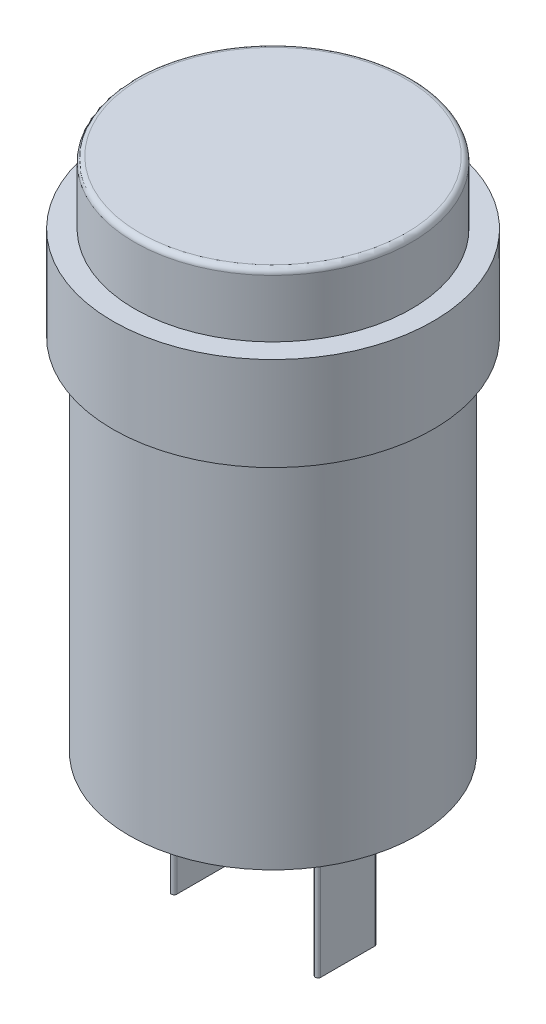
ISO-10303-21;
HEADER;
FILE_DESCRIPTION(('STEP AP214'),'2;1');
FILE_NAME('part.step','',(''),(''),'','','');
FILE_SCHEMA(('AUTOMOTIVE_DESIGN { 1 0 10303 214 1 1 1 1 }'));
ENDSEC;
DATA;
#1=APPLICATION_CONTEXT('core data for automotive mechanical design processes');
#2=APPLICATION_PROTOCOL_DEFINITION('international standard','automotive_design',2000,#1);
#3=PRODUCT_CONTEXT('',#1,'mechanical');
#4=PRODUCT('Part','Part','',(#3));
#5=PRODUCT_RELATED_PRODUCT_CATEGORY('part','',(#4));
#6=PRODUCT_DEFINITION_FORMATION('','',#4);
#7=PRODUCT_DEFINITION_CONTEXT('part definition',#1,'design');
#8=PRODUCT_DEFINITION('design','',#6,#7);
#9=PRODUCT_DEFINITION_SHAPE('','',#8);
#10=(LENGTH_UNIT() NAMED_UNIT(*) SI_UNIT(.MILLI.,.METRE.));
#11=(NAMED_UNIT(*) PLANE_ANGLE_UNIT() SI_UNIT($,.RADIAN.));
#12=(NAMED_UNIT(*) SI_UNIT($,.STERADIAN.) SOLID_ANGLE_UNIT());
#13=UNCERTAINTY_MEASURE_WITH_UNIT(LENGTH_MEASURE(1.E-05),#10,'distance_accuracy_value','');
#14=(GEOMETRIC_REPRESENTATION_CONTEXT(3) GLOBAL_UNCERTAINTY_ASSIGNED_CONTEXT((#13)) GLOBAL_UNIT_ASSIGNED_CONTEXT((#10,
#11,#12)) REPRESENTATION_CONTEXT('',''));
#15=CARTESIAN_POINT('',(0.,0.,0.));
#16=DIRECTION('',(0.,0.,1.));
#17=DIRECTION('',(1.,0.,0.));
#18=AXIS2_PLACEMENT_3D('',#15,#16,#17);
#19=CARTESIAN_POINT('',(0.,9.19984369533566,0.));
#20=DIRECTION('',(0.,1.,0.));
#21=DIRECTION('',(0.,0.,1.));
#22=AXIS2_PLACEMENT_3D('',#19,#20,#21);
#23=PLANE('',#22);
#24=CARTESIAN_POINT('',(0.,9.19984369533566,0.));
#25=DIRECTION('',(0.,1.,0.));
#26=DIRECTION('',(0.,0.,1.));
#27=AXIS2_PLACEMENT_3D('',#24,#25,#26);
#28=CIRCLE('',#27,12.2375);
#29=CARTESIAN_POINT('',(0.,9.19984369533566,12.2375));
#30=VERTEX_POINT('',#29);
#31=EDGE_CURVE('E195',#30,#30,#28,.T.);
#32=ORIENTED_EDGE('',*,*,#31,.T.);
#33=EDGE_LOOP('',(#32));
#34=FACE_BOUND('',#33,.T.);
#35=CARTESIAN_POINT('',(0.,9.19984369533566,0.));
#36=DIRECTION('',(0.,1.,0.));
#37=DIRECTION('',(0.,0.,1.));
#38=AXIS2_PLACEMENT_3D('',#35,#36,#37);
#39=CIRCLE('',#38,10.5875);
#40=CARTESIAN_POINT('',(0.,9.19984369533566,10.5875));
#41=VERTEX_POINT('',#40);
#42=EDGE_CURVE('E267',#41,#41,#39,.T.);
#43=ORIENTED_EDGE('',*,*,#42,.F.);
#44=EDGE_LOOP('',(#43));
#45=FACE_BOUND('',#44,.T.);
#46=ADVANCED_FACE('F51',(#34,#45),#23,.T.);
#47=CARTESIAN_POINT('',(0.,-25.4501563046643,0.));
#48=DIRECTION('',(0.,-1.,0.));
#49=DIRECTION('',(0.,0.,-1.));
#50=AXIS2_PLACEMENT_3D('',#47,#48,#49);
#51=PLANE('',#50);
#52=DIRECTION('',(0.,0.,-1.));
#53=VECTOR('',#52,1.);
#54=CARTESIAN_POINT('',(5.29375,-25.4501563046643,2.0625));
#55=LINE('',#54,#53);
#56=CARTESIAN_POINT('',(5.29375,-25.4501563046643,2.0625));
#57=VERTEX_POINT('',#56);
#58=CARTESIAN_POINT('',(5.29375,-25.4501563046643,-2.0625));
#59=VERTEX_POINT('',#58);
#60=EDGE_CURVE('E151',#57,#59,#55,.T.);
#61=ORIENTED_EDGE('',*,*,#60,.F.);
#62=CARTESIAN_POINT('',(5.5,-25.4501563046643,2.0625));
#63=DIRECTION('',(0.,-1.,0.));
#64=DIRECTION('',(0.,0.,-1.));
#65=AXIS2_PLACEMENT_3D('',#62,#63,#64);
#66=CIRCLE('',#65,0.206249999999999);
#67=CARTESIAN_POINT('',(5.70625,-25.4501563046643,2.0625));
#68=VERTEX_POINT('',#67);
#69=EDGE_CURVE('E146',#68,#57,#66,.T.);
#70=ORIENTED_EDGE('',*,*,#69,.F.);
#71=DIRECTION('',(0.,0.,1.));
#72=VECTOR('',#71,1.);
#73=CARTESIAN_POINT('',(5.70625,-25.4501563046643,2.0625));
#74=LINE('',#73,#72);
#75=CARTESIAN_POINT('',(5.70625,-25.4501563046643,-2.0625));
#76=VERTEX_POINT('',#75);
#77=EDGE_CURVE('E161',#76,#68,#74,.T.);
#78=ORIENTED_EDGE('',*,*,#77,.F.);
#79=CARTESIAN_POINT('',(5.5,-25.4501563046643,-2.0625));
#80=DIRECTION('',(0.,-1.,0.));
#81=DIRECTION('',(0.,0.,-1.));
#82=AXIS2_PLACEMENT_3D('',#79,#80,#81);
#83=CIRCLE('',#82,0.206249999999999);
#84=EDGE_CURVE('E173',#59,#76,#83,.T.);
#85=ORIENTED_EDGE('',*,*,#84,.F.);
#86=EDGE_LOOP('',(#61,#70,#78,#85));
#87=FACE_BOUND('',#86,.T.);
#88=CARTESIAN_POINT('',(0.,-25.4501563046643,0.));
#89=DIRECTION('',(0.,-1.,0.));
#90=DIRECTION('',(0.,0.,-1.));
#91=AXIS2_PLACEMENT_3D('',#88,#89,#90);
#92=CIRCLE('',#91,11.);
#93=CARTESIAN_POINT('',(0.,-25.4501563046643,-11.));
#94=VERTEX_POINT('',#93);
#95=EDGE_CURVE('E190',#94,#94,#92,.T.);
#96=ORIENTED_EDGE('',*,*,#95,.T.);
#97=EDGE_LOOP('',(#96));
#98=FACE_BOUND('',#97,.T.);
#99=DIRECTION('',(0.,0.,-1.));
#100=VECTOR('',#99,1.);
#101=CARTESIAN_POINT('',(-5.70625,-25.4501563046643,2.0625));
#102=LINE('',#101,#100);
#103=CARTESIAN_POINT('',(-5.70625,-25.4501563046643,2.0625));
#104=VERTEX_POINT('',#103);
#105=CARTESIAN_POINT('',(-5.70625,-25.4501563046643,-2.0625));
#106=VERTEX_POINT('',#105);
#107=EDGE_CURVE('E259',#104,#106,#102,.T.);
#108=ORIENTED_EDGE('',*,*,#107,.F.);
#109=CARTESIAN_POINT('',(-5.5,-25.4501563046643,2.0625));
#110=DIRECTION('',(0.,-1.,0.));
#111=DIRECTION('',(0.,0.,-1.));
#112=AXIS2_PLACEMENT_3D('',#109,#110,#111);
#113=CIRCLE('',#112,0.206249999999999);
#114=CARTESIAN_POINT('',(-5.29375,-25.4501563046643,2.0625));
#115=VERTEX_POINT('',#114);
#116=EDGE_CURVE('E143',#115,#104,#113,.T.);
#117=ORIENTED_EDGE('',*,*,#116,.F.);
#118=DIRECTION('',(0.,0.,1.));
#119=VECTOR('',#118,1.);
#120=CARTESIAN_POINT('',(-5.29375,-25.4501563046643,2.0625));
#121=LINE('',#120,#119);
#122=CARTESIAN_POINT('',(-5.29375,-25.4501563046643,-2.0625));
#123=VERTEX_POINT('',#122);
#124=EDGE_CURVE('E139',#123,#115,#121,.T.);
#125=ORIENTED_EDGE('',*,*,#124,.F.);
#126=CARTESIAN_POINT('',(-5.5,-25.4501563046643,-2.0625));
#127=DIRECTION('',(0.,-1.,0.));
#128=DIRECTION('',(0.,0.,-1.));
#129=AXIS2_PLACEMENT_3D('',#126,#127,#128);
#130=CIRCLE('',#129,0.206249999999999);
#131=EDGE_CURVE('E261',#106,#123,#130,.T.);
#132=ORIENTED_EDGE('',*,*,#131,.F.);
#133=EDGE_LOOP('',(#108,#117,#125,#132));
#134=FACE_BOUND('',#133,.T.);
#135=ADVANCED_FACE('F220',(#87,#98,#134),#51,.T.);
#136=CARTESIAN_POINT('',(0.,2.04984369533566,0.));
#137=DIRECTION('',(0.,1.,0.));
#138=DIRECTION('',(0.,0.,1.));
#139=AXIS2_PLACEMENT_3D('',#136,#137,#138);
#140=PLANE('',#139);
#141=CARTESIAN_POINT('',(0.,2.04984369533566,0.));
#142=DIRECTION('',(0.,1.,0.));
#143=DIRECTION('',(0.,0.,1.));
#144=AXIS2_PLACEMENT_3D('',#141,#142,#143);
#145=CIRCLE('',#144,12.2375);
#146=CARTESIAN_POINT('',(0.,2.04984369533566,12.2375));
#147=VERTEX_POINT('',#146);
#148=EDGE_CURVE('E194',#147,#147,#145,.T.);
#149=ORIENTED_EDGE('',*,*,#148,.F.);
#150=EDGE_LOOP('',(#149));
#151=FACE_BOUND('',#150,.T.);
#152=CARTESIAN_POINT('',(0.,2.04984369533566,0.));
#153=DIRECTION('',(0.,1.,0.));
#154=DIRECTION('',(0.,0.,1.));
#155=AXIS2_PLACEMENT_3D('',#152,#153,#154);
#156=CIRCLE('',#155,11.);
#157=CARTESIAN_POINT('',(0.,2.04984369533566,11.));
#158=VERTEX_POINT('',#157);
#159=EDGE_CURVE('E199',#158,#158,#156,.F.);
#160=ORIENTED_EDGE('',*,*,#159,.F.);
#161=EDGE_LOOP('',(#160));
#162=FACE_BOUND('',#161,.T.);
#163=ADVANCED_FACE('F226',(#151,#162),#140,.F.);
#164=CARTESIAN_POINT('',(0.,9.19984369533566,0.));
#165=DIRECTION('',(0.,-1.,0.));
#166=DIRECTION('',(0.,0.,-1.));
#167=AXIS2_PLACEMENT_3D('',#164,#165,#166);
#168=CYLINDRICAL_SURFACE('',#167,12.2375);
#169=ORIENTED_EDGE('',*,*,#31,.F.);
#170=EDGE_LOOP('',(#169));
#171=FACE_BOUND('',#170,.T.);
#172=ORIENTED_EDGE('',*,*,#148,.T.);
#173=EDGE_LOOP('',(#172));
#174=FACE_BOUND('',#173,.T.);
#175=ADVANCED_FACE('F234',(#171,#174),#168,.T.);
#176=CARTESIAN_POINT('',(0.,-25.4501563046643,0.));
#177=DIRECTION('',(0.,1.,0.));
#178=DIRECTION('',(0.,0.,1.));
#179=AXIS2_PLACEMENT_3D('',#176,#177,#178);
#180=CYLINDRICAL_SURFACE('',#179,11.);
#181=ORIENTED_EDGE('',*,*,#95,.F.);
#182=EDGE_LOOP('',(#181));
#183=FACE_BOUND('',#182,.T.);
#184=ORIENTED_EDGE('',*,*,#159,.T.);
#185=EDGE_LOOP('',(#184));
#186=FACE_BOUND('',#185,.T.);
#187=ADVANCED_FACE('F232',(#183,#186),#180,.T.);
#188=CARTESIAN_POINT('',(5.5,-36.4501563046643,2.0625));
#189=DIRECTION('',(0.,1.,0.));
#190=DIRECTION('',(0.,0.,1.));
#191=AXIS2_PLACEMENT_3D('',#188,#189,#190);
#192=CYLINDRICAL_SURFACE('',#191,0.206249999999999);
#193=ORIENTED_EDGE('',*,*,#69,.T.);
#194=DIRECTION('',(0.,1.,0.));
#195=VECTOR('',#194,1.);
#196=CARTESIAN_POINT('',(5.29375,-36.4501563046643,2.0625));
#197=LINE('',#196,#195);
#198=CARTESIAN_POINT('',(5.29375,-36.4501563046643,2.0625));
#199=VERTEX_POINT('',#198);
#200=EDGE_CURVE('E187',#199,#57,#197,.T.);
#201=ORIENTED_EDGE('',*,*,#200,.F.);
#202=CARTESIAN_POINT('',(5.5,-36.4501563046643,2.0625));
#203=DIRECTION('',(0.,-1.,0.));
#204=DIRECTION('',(0.,0.,-1.));
#205=AXIS2_PLACEMENT_3D('',#202,#203,#204);
#206=CIRCLE('',#205,0.206249999999999);
#207=CARTESIAN_POINT('',(5.70625,-36.4501563046643,2.0625));
#208=VERTEX_POINT('',#207);
#209=EDGE_CURVE('E156',#208,#199,#206,.T.);
#210=ORIENTED_EDGE('',*,*,#209,.F.);
#211=DIRECTION('',(0.,1.,0.));
#212=VECTOR('',#211,1.);
#213=CARTESIAN_POINT('',(5.70625,-36.4501563046643,2.0625));
#214=LINE('',#213,#212);
#215=EDGE_CURVE('E169',#208,#68,#214,.T.);
#216=ORIENTED_EDGE('',*,*,#215,.T.);
#217=EDGE_LOOP('',(#193,#201,#210,#216));
#218=FACE_BOUND('',#217,.T.);
#219=ADVANCED_FACE('F241',(#218),#192,.T.);
#220=CARTESIAN_POINT('',(5.29375,-36.4501563046643,2.0625));
#221=DIRECTION('',(1.,0.,0.));
#222=DIRECTION('',(0.,0.,-1.));
#223=AXIS2_PLACEMENT_3D('',#220,#221,#222);
#224=PLANE('',#223);
#225=ORIENTED_EDGE('',*,*,#60,.T.);
#226=DIRECTION('',(0.,1.,0.));
#227=VECTOR('',#226,1.);
#228=CARTESIAN_POINT('',(5.29375,-36.4501563046643,-2.0625));
#229=LINE('',#228,#227);
#230=CARTESIAN_POINT('',(5.29375,-36.4501563046643,-2.0625));
#231=VERTEX_POINT('',#230);
#232=EDGE_CURVE('E183',#231,#59,#229,.T.);
#233=ORIENTED_EDGE('',*,*,#232,.F.);
#234=DIRECTION('',(0.,0.,-1.));
#235=VECTOR('',#234,1.);
#236=CARTESIAN_POINT('',(5.29375,-36.4501563046643,2.0625));
#237=LINE('',#236,#235);
#238=EDGE_CURVE('E160',#199,#231,#237,.T.);
#239=ORIENTED_EDGE('',*,*,#238,.F.);
#240=ORIENTED_EDGE('',*,*,#200,.T.);
#241=EDGE_LOOP('',(#225,#233,#239,#240));
#242=FACE_BOUND('',#241,.T.);
#243=ADVANCED_FACE('F252',(#242),#224,.F.);
#244=CARTESIAN_POINT('',(5.5,-36.4501563046643,-2.0625));
#245=DIRECTION('',(0.,1.,0.));
#246=DIRECTION('',(0.,0.,1.));
#247=AXIS2_PLACEMENT_3D('',#244,#245,#246);
#248=CYLINDRICAL_SURFACE('',#247,0.206249999999999);
#249=ORIENTED_EDGE('',*,*,#84,.T.);
#250=DIRECTION('',(0.,1.,0.));
#251=VECTOR('',#250,1.);
#252=CARTESIAN_POINT('',(5.70625,-36.4501563046643,-2.0625));
#253=LINE('',#252,#251);
#254=CARTESIAN_POINT('',(5.70625,-36.4501563046643,-2.0625));
#255=VERTEX_POINT('',#254);
#256=EDGE_CURVE('E75',#255,#76,#253,.T.);
#257=ORIENTED_EDGE('',*,*,#256,.F.);
#258=CARTESIAN_POINT('',(5.5,-36.4501563046643,-2.0625));
#259=DIRECTION('',(0.,-1.,0.));
#260=DIRECTION('',(0.,0.,-1.));
#261=AXIS2_PLACEMENT_3D('',#258,#259,#260);
#262=CIRCLE('',#261,0.206249999999999);
#263=EDGE_CURVE('E164',#231,#255,#262,.T.);
#264=ORIENTED_EDGE('',*,*,#263,.F.);
#265=ORIENTED_EDGE('',*,*,#232,.T.);
#266=EDGE_LOOP('',(#249,#257,#264,#265));
#267=FACE_BOUND('',#266,.T.);
#268=ADVANCED_FACE('F310',(#267),#248,.T.);
#269=CARTESIAN_POINT('',(5.70625,-36.4501563046643,2.0625));
#270=DIRECTION('',(-1.,0.,0.));
#271=DIRECTION('',(0.,0.,1.));
#272=AXIS2_PLACEMENT_3D('',#269,#270,#271);
#273=PLANE('',#272);
#274=ORIENTED_EDGE('',*,*,#77,.T.);
#275=ORIENTED_EDGE('',*,*,#215,.F.);
#276=DIRECTION('',(0.,0.,1.));
#277=VECTOR('',#276,1.);
#278=CARTESIAN_POINT('',(5.70625,-36.4501563046643,2.0625));
#279=LINE('',#278,#277);
#280=EDGE_CURVE('E167',#255,#208,#279,.T.);
#281=ORIENTED_EDGE('',*,*,#280,.F.);
#282=ORIENTED_EDGE('',*,*,#256,.T.);
#283=EDGE_LOOP('',(#274,#275,#281,#282));
#284=FACE_BOUND('',#283,.T.);
#285=ADVANCED_FACE('F306',(#284),#273,.F.);
#286=CARTESIAN_POINT('',(5.5,-36.4501563046643,2.0625));
#287=DIRECTION('',(0.,-1.,0.));
#288=DIRECTION('',(0.,0.,-1.));
#289=AXIS2_PLACEMENT_3D('',#286,#287,#288);
#290=PLANE('',#289);
#291=ORIENTED_EDGE('',*,*,#209,.T.);
#292=ORIENTED_EDGE('',*,*,#238,.T.);
#293=ORIENTED_EDGE('',*,*,#263,.T.);
#294=ORIENTED_EDGE('',*,*,#280,.T.);
#295=EDGE_LOOP('',(#291,#292,#293,#294));
#296=FACE_BOUND('',#295,.T.);
#297=ADVANCED_FACE('F303',(#296),#290,.T.);
#298=CARTESIAN_POINT('',(-5.5,-36.4501563046643,2.0625));
#299=DIRECTION('',(0.,1.,0.));
#300=DIRECTION('',(0.,0.,1.));
#301=AXIS2_PLACEMENT_3D('',#298,#299,#300);
#302=CYLINDRICAL_SURFACE('',#301,0.206249999999999);
#303=ORIENTED_EDGE('',*,*,#116,.T.);
#304=DIRECTION('',(0.,1.,0.));
#305=VECTOR('',#304,1.);
#306=CARTESIAN_POINT('',(-5.70625,-36.4501563046643,2.0625));
#307=LINE('',#306,#305);
#308=CARTESIAN_POINT('',(-5.70625,-36.4501563046643,2.0625));
#309=VERTEX_POINT('',#308);
#310=EDGE_CURVE('E122',#309,#104,#307,.T.);
#311=ORIENTED_EDGE('',*,*,#310,.F.);
#312=CARTESIAN_POINT('',(-5.5,-36.4501563046643,2.0625));
#313=DIRECTION('',(0.,-1.,0.));
#314=DIRECTION('',(0.,0.,-1.));
#315=AXIS2_PLACEMENT_3D('',#312,#313,#314);
#316=CIRCLE('',#315,0.206249999999999);
#317=CARTESIAN_POINT('',(-5.29375,-36.4501563046643,2.0625));
#318=VERTEX_POINT('',#317);
#319=EDGE_CURVE('E130',#318,#309,#316,.T.);
#320=ORIENTED_EDGE('',*,*,#319,.F.);
#321=DIRECTION('',(0.,1.,0.));
#322=VECTOR('',#321,1.);
#323=CARTESIAN_POINT('',(-5.29375,-36.4501563046643,2.0625));
#324=LINE('',#323,#322);
#325=EDGE_CURVE('E273',#318,#115,#324,.T.);
#326=ORIENTED_EDGE('',*,*,#325,.T.);
#327=EDGE_LOOP('',(#303,#311,#320,#326));
#328=FACE_BOUND('',#327,.T.);
#329=ADVANCED_FACE('F141',(#328),#302,.T.);
#330=CARTESIAN_POINT('',(-5.70625,-36.4501563046643,2.0625));
#331=DIRECTION('',(1.,0.,0.));
#332=DIRECTION('',(0.,0.,-1.));
#333=AXIS2_PLACEMENT_3D('',#330,#331,#332);
#334=PLANE('',#333);
#335=ORIENTED_EDGE('',*,*,#107,.T.);
#336=DIRECTION('',(0.,1.,0.));
#337=VECTOR('',#336,1.);
#338=CARTESIAN_POINT('',(-5.70625,-36.4501563046643,-2.0625));
#339=LINE('',#338,#337);
#340=CARTESIAN_POINT('',(-5.70625,-36.4501563046643,-2.0625));
#341=VERTEX_POINT('',#340);
#342=EDGE_CURVE('E125',#341,#106,#339,.T.);
#343=ORIENTED_EDGE('',*,*,#342,.F.);
#344=DIRECTION('',(0.,0.,-1.));
#345=VECTOR('',#344,1.);
#346=CARTESIAN_POINT('',(-5.70625,-36.4501563046643,2.0625));
#347=LINE('',#346,#345);
#348=EDGE_CURVE('E118',#309,#341,#347,.T.);
#349=ORIENTED_EDGE('',*,*,#348,.F.);
#350=ORIENTED_EDGE('',*,*,#310,.T.);
#351=EDGE_LOOP('',(#335,#343,#349,#350));
#352=FACE_BOUND('',#351,.T.);
#353=ADVANCED_FACE('F120',(#352),#334,.F.);
#354=CARTESIAN_POINT('',(-5.5,-36.4501563046643,-2.0625));
#355=DIRECTION('',(0.,1.,0.));
#356=DIRECTION('',(0.,0.,1.));
#357=AXIS2_PLACEMENT_3D('',#354,#355,#356);
#358=CYLINDRICAL_SURFACE('',#357,0.206249999999999);
#359=ORIENTED_EDGE('',*,*,#131,.T.);
#360=DIRECTION('',(0.,1.,0.));
#361=VECTOR('',#360,1.);
#362=CARTESIAN_POINT('',(-5.29375,-36.4501563046643,-2.0625));
#363=LINE('',#362,#361);
#364=CARTESIAN_POINT('',(-5.29375,-36.4501563046643,-2.0625));
#365=VERTEX_POINT('',#364);
#366=EDGE_CURVE('E67',#365,#123,#363,.T.);
#367=ORIENTED_EDGE('',*,*,#366,.F.);
#368=CARTESIAN_POINT('',(-5.5,-36.4501563046643,-2.0625));
#369=DIRECTION('',(0.,-1.,0.));
#370=DIRECTION('',(0.,0.,-1.));
#371=AXIS2_PLACEMENT_3D('',#368,#369,#370);
#372=CIRCLE('',#371,0.206249999999999);
#373=EDGE_CURVE('E129',#341,#365,#372,.T.);
#374=ORIENTED_EDGE('',*,*,#373,.F.);
#375=ORIENTED_EDGE('',*,*,#342,.T.);
#376=EDGE_LOOP('',(#359,#367,#374,#375));
#377=FACE_BOUND('',#376,.T.);
#378=ADVANCED_FACE('F295',(#377),#358,.T.);
#379=CARTESIAN_POINT('',(-5.29375,-36.4501563046643,2.0625));
#380=DIRECTION('',(-1.,0.,0.));
#381=DIRECTION('',(0.,0.,1.));
#382=AXIS2_PLACEMENT_3D('',#379,#380,#381);
#383=PLANE('',#382);
#384=ORIENTED_EDGE('',*,*,#124,.T.);
#385=ORIENTED_EDGE('',*,*,#325,.F.);
#386=DIRECTION('',(0.,0.,1.));
#387=VECTOR('',#386,1.);
#388=CARTESIAN_POINT('',(-5.29375,-36.4501563046643,2.0625));
#389=LINE('',#388,#387);
#390=EDGE_CURVE('E134',#365,#318,#389,.T.);
#391=ORIENTED_EDGE('',*,*,#390,.F.);
#392=ORIENTED_EDGE('',*,*,#366,.T.);
#393=EDGE_LOOP('',(#384,#385,#391,#392));
#394=FACE_BOUND('',#393,.T.);
#395=ADVANCED_FACE('F290',(#394),#383,.F.);
#396=CARTESIAN_POINT('',(-5.5,-36.4501563046643,2.0625));
#397=DIRECTION('',(0.,-1.,0.));
#398=DIRECTION('',(0.,0.,-1.));
#399=AXIS2_PLACEMENT_3D('',#396,#397,#398);
#400=PLANE('',#399);
#401=ORIENTED_EDGE('',*,*,#319,.T.);
#402=ORIENTED_EDGE('',*,*,#348,.T.);
#403=ORIENTED_EDGE('',*,*,#373,.T.);
#404=ORIENTED_EDGE('',*,*,#390,.T.);
#405=EDGE_LOOP('',(#401,#402,#403,#404));
#406=FACE_BOUND('',#405,.T.);
#407=ADVANCED_FACE('F133',(#406),#400,.T.);
#408=CARTESIAN_POINT('',(0.,14.0123436953357,0.));
#409=DIRECTION('',(0.,-1.,0.));
#410=DIRECTION('',(0.,0.,-1.));
#411=AXIS2_PLACEMENT_3D('',#408,#409,#410);
#412=CYLINDRICAL_SURFACE('',#411,10.5875);
#413=CARTESIAN_POINT('',(0.,13.5998436953357,0.));
#414=DIRECTION('',(0.,1.,0.));
#415=DIRECTION('',(0.,0.,1.));
#416=AXIS2_PLACEMENT_3D('',#413,#414,#415);
#417=CIRCLE('',#416,10.5875);
#418=CARTESIAN_POINT('',(0.,13.5998436953357,10.5875));
#419=VERTEX_POINT('',#418);
#420=EDGE_CURVE('E11',#419,#419,#417,.F.);
#421=ORIENTED_EDGE('',*,*,#420,.T.);
#422=EDGE_LOOP('',(#421));
#423=FACE_BOUND('',#422,.T.);
#424=ORIENTED_EDGE('',*,*,#42,.T.);
#425=EDGE_LOOP('',(#424));
#426=FACE_BOUND('',#425,.T.);
#427=ADVANCED_FACE('F216',(#423,#426),#412,.T.);
#428=CARTESIAN_POINT('',(0.,14.0123436953357,0.));
#429=DIRECTION('',(0.,1.,0.));
#430=DIRECTION('',(0.,0.,1.));
#431=AXIS2_PLACEMENT_3D('',#428,#429,#430);
#432=PLANE('',#431);
#433=CARTESIAN_POINT('',(0.,14.0123436953357,0.));
#434=DIRECTION('',(0.,1.,0.));
#435=DIRECTION('',(0.,0.,1.));
#436=AXIS2_PLACEMENT_3D('',#433,#434,#435);
#437=CIRCLE('',#436,10.175);
#438=CARTESIAN_POINT('',(0.,14.0123436953357,10.175));
#439=VERTEX_POINT('',#438);
#440=EDGE_CURVE('E60',#439,#439,#437,.T.);
#441=ORIENTED_EDGE('',*,*,#440,.T.);
#442=EDGE_LOOP('',(#441));
#443=FACE_BOUND('',#442,.T.);
#444=ADVANCED_FACE('F209',(#443),#432,.T.);
#445=CARTESIAN_POINT('',(0.,13.5998436953357,0.));
#446=DIRECTION('',(0.,1.,0.));
#447=DIRECTION('',(0.,0.,1.));
#448=AXIS2_PLACEMENT_3D('',#445,#446,#447);
#449=TOROIDAL_SURFACE('',#448,10.175,0.4125);
#450=ORIENTED_EDGE('',*,*,#420,.F.);
#451=EDGE_LOOP('',(#450));
#452=FACE_BOUND('',#451,.T.);
#453=ORIENTED_EDGE('',*,*,#440,.F.);
#454=EDGE_LOOP('',(#453));
#455=FACE_BOUND('',#454,.T.);
#456=ADVANCED_FACE('F53',(#452,#455),#449,.T.);
#457=CLOSED_SHELL('',(#46,#135,#163,#175,#187,#219,#243,#268,#285,#297,#329,#353,#378,#395,#407,
#427,#444,#456));
#458=MANIFOLD_SOLID_BREP('B2',#457);
#459=ADVANCED_BREP_SHAPE_REPRESENTATION('',(#18,#458),#14);
#460=SHAPE_DEFINITION_REPRESENTATION(#9,#459);
ENDSEC;
END-ISO-10303-21;
